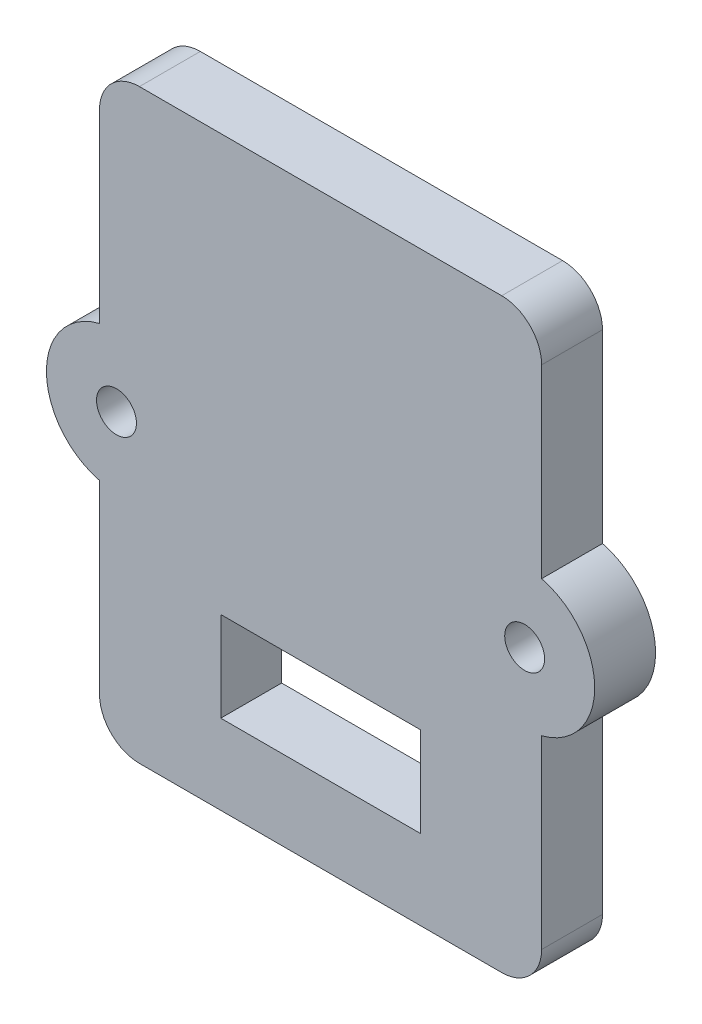
ISO-10303-21;
HEADER;
FILE_DESCRIPTION(('STEP AP214'),'2;1');
FILE_NAME('part.step','',(''),(''),'','','');
FILE_SCHEMA(('AUTOMOTIVE_DESIGN { 1 0 10303 214 1 1 1 1 }'));
ENDSEC;
DATA;
#1=APPLICATION_CONTEXT('core data for automotive mechanical design processes');
#2=APPLICATION_PROTOCOL_DEFINITION('international standard','automotive_design',2000,#1);
#3=PRODUCT_CONTEXT('',#1,'mechanical');
#4=PRODUCT('Part','Part','',(#3));
#5=PRODUCT_RELATED_PRODUCT_CATEGORY('part','',(#4));
#6=PRODUCT_DEFINITION_FORMATION('','',#4);
#7=PRODUCT_DEFINITION_CONTEXT('part definition',#1,'design');
#8=PRODUCT_DEFINITION('design','',#6,#7);
#9=PRODUCT_DEFINITION_SHAPE('','',#8);
#10=(LENGTH_UNIT() NAMED_UNIT(*) SI_UNIT(.MILLI.,.METRE.));
#11=(NAMED_UNIT(*) PLANE_ANGLE_UNIT() SI_UNIT($,.RADIAN.));
#12=(NAMED_UNIT(*) SI_UNIT($,.STERADIAN.) SOLID_ANGLE_UNIT());
#13=UNCERTAINTY_MEASURE_WITH_UNIT(LENGTH_MEASURE(1.E-05),#10,'distance_accuracy_value','');
#14=(GEOMETRIC_REPRESENTATION_CONTEXT(3) GLOBAL_UNCERTAINTY_ASSIGNED_CONTEXT((#13)) GLOBAL_UNIT_ASSIGNED_CONTEXT((#10,
#11,#12)) REPRESENTATION_CONTEXT('',''));
#15=CARTESIAN_POINT('',(0.,0.,0.));
#16=DIRECTION('',(0.,0.,1.));
#17=DIRECTION('',(1.,0.,0.));
#18=AXIS2_PLACEMENT_3D('',#15,#16,#17);
#19=CARTESIAN_POINT('',(-9.075,-0.233587825680568,3.05));
#20=DIRECTION('',(0.,0.,-1.));
#21=DIRECTION('',(-1.,0.,0.));
#22=AXIS2_PLACEMENT_3D('',#19,#20,#21);
#23=PLANE('',#22);
#24=CARTESIAN_POINT('',(10.225,12.45,3.05));
#25=DIRECTION('',(0.,0.,1.));
#26=DIRECTION('',(-1.,0.,0.));
#27=AXIS2_PLACEMENT_3D('',#24,#25,#26);
#28=CIRCLE('',#27,1.);
#29=CARTESIAN_POINT('',(9.225,12.45,3.05));
#30=VERTEX_POINT('',#29);
#31=EDGE_CURVE('E190',#30,#30,#28,.T.);
#32=ORIENTED_EDGE('',*,*,#31,.F.);
#33=EDGE_LOOP('',(#32));
#34=FACE_BOUND('',#33,.T.);
#35=CARTESIAN_POINT('',(-10.225,12.45,3.05));
#36=DIRECTION('',(0.,0.,1.));
#37=DIRECTION('',(1.,0.,0.));
#38=AXIS2_PLACEMENT_3D('',#35,#36,#37);
#39=CIRCLE('',#38,1.);
#40=CARTESIAN_POINT('',(-9.22499999999999,12.45,3.05));
#41=VERTEX_POINT('',#40);
#42=EDGE_CURVE('E196',#41,#41,#39,.T.);
#43=ORIENTED_EDGE('',*,*,#42,.F.);
#44=EDGE_LOOP('',(#43));
#45=FACE_BOUND('',#44,.T.);
#46=CARTESIAN_POINT('',(-9.075,-0.233587825680568,3.05));
#47=DIRECTION('',(0.,0.,1.));
#48=DIRECTION('',(-1.,0.,0.));
#49=AXIS2_PLACEMENT_3D('',#46,#47,#48);
#50=CIRCLE('',#49,2.);
#51=CARTESIAN_POINT('',(-11.075,-0.233587825680554,3.05));
#52=VERTEX_POINT('',#51);
#53=CARTESIAN_POINT('',(-9.07499999999998,-2.23358782568057,3.05));
#54=VERTEX_POINT('',#53);
#55=EDGE_CURVE('E202',#52,#54,#50,.T.);
#56=ORIENTED_EDGE('',*,*,#55,.T.);
#57=DIRECTION('',(1.,0.,0.));
#58=VECTOR('',#57,1.);
#59=CARTESIAN_POINT('',(-9.07499999999998,-2.23358782568057,3.05));
#60=LINE('',#59,#58);
#61=CARTESIAN_POINT('',(9.07499999999999,-2.23358782568057,3.05));
#62=VERTEX_POINT('',#61);
#63=EDGE_CURVE('E205',#54,#62,#60,.T.);
#64=ORIENTED_EDGE('',*,*,#63,.T.);
#65=CARTESIAN_POINT('',(9.075,-0.233587825680566,3.05));
#66=DIRECTION('',(0.,0.,1.));
#67=DIRECTION('',(1.,0.,0.));
#68=AXIS2_PLACEMENT_3D('',#65,#66,#67);
#69=CIRCLE('',#68,2.);
#70=CARTESIAN_POINT('',(11.075,-0.233587825680566,3.05));
#71=VERTEX_POINT('',#70);
#72=EDGE_CURVE('E208',#62,#71,#69,.T.);
#73=ORIENTED_EDGE('',*,*,#72,.T.);
#74=DIRECTION('',(0.,1.,0.));
#75=VECTOR('',#74,1.);
#76=CARTESIAN_POINT('',(11.075,-0.233587825680551,3.05));
#77=LINE('',#76,#75);
#78=CARTESIAN_POINT('',(11.075,9.04447507717238,3.05));
#79=VERTEX_POINT('',#78);
#80=EDGE_CURVE('E210',#71,#79,#77,.T.);
#81=ORIENTED_EDGE('',*,*,#80,.T.);
#82=CARTESIAN_POINT('',(10.225,12.45,3.05));
#83=DIRECTION('',(0.,0.,1.));
#84=DIRECTION('',(-1.,0.,0.));
#85=AXIS2_PLACEMENT_3D('',#82,#83,#84);
#86=CIRCLE('',#85,3.51);
#87=CARTESIAN_POINT('',(11.075,15.8555249228276,3.05));
#88=VERTEX_POINT('',#87);
#89=EDGE_CURVE('E212',#79,#88,#86,.T.);
#90=ORIENTED_EDGE('',*,*,#89,.T.);
#91=DIRECTION('',(0.,1.,0.));
#92=VECTOR('',#91,1.);
#93=CARTESIAN_POINT('',(11.075,15.8555249228276,3.05));
#94=LINE('',#93,#92);
#95=CARTESIAN_POINT('',(11.075,25.1335878256805,3.05));
#96=VERTEX_POINT('',#95);
#97=EDGE_CURVE('E214',#88,#96,#94,.T.);
#98=ORIENTED_EDGE('',*,*,#97,.T.);
#99=CARTESIAN_POINT('',(9.075,25.1335878256806,3.05));
#100=DIRECTION('',(0.,0.,1.));
#101=DIRECTION('',(-1.,0.,0.));
#102=AXIS2_PLACEMENT_3D('',#99,#100,#101);
#103=CIRCLE('',#102,2.);
#104=CARTESIAN_POINT('',(9.07499999999999,27.1335878256806,3.05));
#105=VERTEX_POINT('',#104);
#106=EDGE_CURVE('E216',#96,#105,#103,.T.);
#107=ORIENTED_EDGE('',*,*,#106,.T.);
#108=DIRECTION('',(-1.,0.,0.));
#109=VECTOR('',#108,1.);
#110=CARTESIAN_POINT('',(-9.07499999999999,27.1335878256806,3.05));
#111=LINE('',#110,#109);
#112=CARTESIAN_POINT('',(-9.07499999999999,27.1335878256806,3.05));
#113=VERTEX_POINT('',#112);
#114=EDGE_CURVE('E218',#105,#113,#111,.T.);
#115=ORIENTED_EDGE('',*,*,#114,.T.);
#116=CARTESIAN_POINT('',(-9.075,25.1335878256806,3.05));
#117=DIRECTION('',(0.,0.,1.));
#118=DIRECTION('',(-1.,0.,0.));
#119=AXIS2_PLACEMENT_3D('',#116,#117,#118);
#120=CIRCLE('',#119,2.);
#121=CARTESIAN_POINT('',(-11.075,25.1335878256805,3.05));
#122=VERTEX_POINT('',#121);
#123=EDGE_CURVE('E220',#113,#122,#120,.T.);
#124=ORIENTED_EDGE('',*,*,#123,.T.);
#125=DIRECTION('',(0.,-1.,0.));
#126=VECTOR('',#125,1.);
#127=CARTESIAN_POINT('',(-11.075,15.8555249228276,3.05));
#128=LINE('',#127,#126);
#129=CARTESIAN_POINT('',(-11.075,15.8555249228276,3.05));
#130=VERTEX_POINT('',#129);
#131=EDGE_CURVE('E222',#122,#130,#128,.T.);
#132=ORIENTED_EDGE('',*,*,#131,.T.);
#133=CARTESIAN_POINT('',(-10.225,12.45,3.05));
#134=DIRECTION('',(0.,0.,1.));
#135=DIRECTION('',(1.,0.,0.));
#136=AXIS2_PLACEMENT_3D('',#133,#134,#135);
#137=CIRCLE('',#136,3.51);
#138=CARTESIAN_POINT('',(-11.075,9.04447507717239,3.05));
#139=VERTEX_POINT('',#138);
#140=EDGE_CURVE('E224',#130,#139,#137,.T.);
#141=ORIENTED_EDGE('',*,*,#140,.T.);
#142=DIRECTION('',(0.,-1.,0.));
#143=VECTOR('',#142,1.);
#144=CARTESIAN_POINT('',(-11.075,-0.233587825680554,3.05));
#145=LINE('',#144,#143);
#146=EDGE_CURVE('E226',#139,#52,#145,.T.);
#147=ORIENTED_EDGE('',*,*,#146,.T.);
#148=EDGE_LOOP('',(#56,#64,#73,#81,#90,#98,#107,#115,#124,#132,#141,#147));
#149=FACE_BOUND('',#148,.T.);
#150=DIRECTION('',(0.,1.,0.));
#151=VECTOR('',#150,1.);
#152=CARTESIAN_POINT('',(5.,1.76641217431943,3.05));
#153=LINE('',#152,#151);
#154=CARTESIAN_POINT('',(5.,1.76641217431943,3.05));
#155=VERTEX_POINT('',#154);
#156=CARTESIAN_POINT('',(5.,6.26641217431943,3.05));
#157=VERTEX_POINT('',#156);
#158=EDGE_CURVE('E154',#155,#157,#153,.T.);
#159=ORIENTED_EDGE('',*,*,#158,.F.);
#160=DIRECTION('',(1.,0.,0.));
#161=VECTOR('',#160,1.);
#162=CARTESIAN_POINT('',(-5.,1.76641217431943,3.05));
#163=LINE('',#162,#161);
#164=CARTESIAN_POINT('',(-5.,1.76641217431943,3.05));
#165=VERTEX_POINT('',#164);
#166=EDGE_CURVE('E176',#165,#155,#163,.T.);
#167=ORIENTED_EDGE('',*,*,#166,.F.);
#168=DIRECTION('',(0.,-1.,0.));
#169=VECTOR('',#168,1.);
#170=CARTESIAN_POINT('',(-5.,1.76641217431943,3.05));
#171=LINE('',#170,#169);
#172=CARTESIAN_POINT('',(-5.,6.26641217431943,3.05));
#173=VERTEX_POINT('',#172);
#174=EDGE_CURVE('E174',#173,#165,#171,.T.);
#175=ORIENTED_EDGE('',*,*,#174,.F.);
#176=DIRECTION('',(-1.,0.,0.));
#177=VECTOR('',#176,1.);
#178=CARTESIAN_POINT('',(-5.,6.26641217431943,3.05));
#179=LINE('',#178,#177);
#180=EDGE_CURVE('E162',#157,#173,#179,.T.);
#181=ORIENTED_EDGE('',*,*,#180,.F.);
#182=EDGE_LOOP('',(#159,#167,#175,#181));
#183=FACE_BOUND('',#182,.T.);
#184=ADVANCED_FACE('F41',(#34,#45,#149,#183),#23,.F.);
#185=CARTESIAN_POINT('',(-9.075,-0.233587825680568,0.));
#186=DIRECTION('',(0.,0.,-1.));
#187=DIRECTION('',(-1.,0.,0.));
#188=AXIS2_PLACEMENT_3D('',#185,#186,#187);
#189=PLANE('',#188);
#190=CARTESIAN_POINT('',(-10.225,12.45,0.));
#191=DIRECTION('',(0.,0.,1.));
#192=DIRECTION('',(1.,0.,0.));
#193=AXIS2_PLACEMENT_3D('',#190,#191,#192);
#194=CIRCLE('',#193,1.);
#195=CARTESIAN_POINT('',(-9.22499999999999,12.45,0.));
#196=VERTEX_POINT('',#195);
#197=EDGE_CURVE('E193',#196,#196,#194,.T.);
#198=ORIENTED_EDGE('',*,*,#197,.T.);
#199=EDGE_LOOP('',(#198));
#200=FACE_BOUND('',#199,.T.);
#201=CARTESIAN_POINT('',(-9.075,-0.233587825680568,0.));
#202=DIRECTION('',(0.,0.,1.));
#203=DIRECTION('',(-1.,0.,0.));
#204=AXIS2_PLACEMENT_3D('',#201,#202,#203);
#205=CIRCLE('',#204,2.);
#206=CARTESIAN_POINT('',(-11.075,-0.233587825680554,0.));
#207=VERTEX_POINT('',#206);
#208=CARTESIAN_POINT('',(-9.07499999999998,-2.23358782568057,0.));
#209=VERTEX_POINT('',#208);
#210=EDGE_CURVE('E199',#207,#209,#205,.T.);
#211=ORIENTED_EDGE('',*,*,#210,.F.);
#212=DIRECTION('',(0.,-1.,0.));
#213=VECTOR('',#212,1.);
#214=CARTESIAN_POINT('',(-11.075,-0.233587825680554,0.));
#215=LINE('',#214,#213);
#216=CARTESIAN_POINT('',(-11.075,9.04447507717239,0.));
#217=VERTEX_POINT('',#216);
#218=EDGE_CURVE('E206',#217,#207,#215,.T.);
#219=ORIENTED_EDGE('',*,*,#218,.F.);
#220=CARTESIAN_POINT('',(-10.225,12.45,0.));
#221=DIRECTION('',(0.,0.,1.));
#222=DIRECTION('',(1.,0.,0.));
#223=AXIS2_PLACEMENT_3D('',#220,#221,#222);
#224=CIRCLE('',#223,3.51);
#225=CARTESIAN_POINT('',(-11.075,15.8555249228276,0.));
#226=VERTEX_POINT('',#225);
#227=EDGE_CURVE('E249',#226,#217,#224,.T.);
#228=ORIENTED_EDGE('',*,*,#227,.F.);
#229=DIRECTION('',(0.,-1.,0.));
#230=VECTOR('',#229,1.);
#231=CARTESIAN_POINT('',(-11.075,15.8555249228276,0.));
#232=LINE('',#231,#230);
#233=CARTESIAN_POINT('',(-11.075,25.1335878256805,0.));
#234=VERTEX_POINT('',#233);
#235=EDGE_CURVE('E247',#234,#226,#232,.T.);
#236=ORIENTED_EDGE('',*,*,#235,.F.);
#237=CARTESIAN_POINT('',(-9.075,25.1335878256806,0.));
#238=DIRECTION('',(0.,0.,1.));
#239=DIRECTION('',(-1.,0.,0.));
#240=AXIS2_PLACEMENT_3D('',#237,#238,#239);
#241=CIRCLE('',#240,2.);
#242=CARTESIAN_POINT('',(-9.07499999999999,27.1335878256806,0.));
#243=VERTEX_POINT('',#242);
#244=EDGE_CURVE('E245',#243,#234,#241,.T.);
#245=ORIENTED_EDGE('',*,*,#244,.F.);
#246=DIRECTION('',(-1.,0.,0.));
#247=VECTOR('',#246,1.);
#248=CARTESIAN_POINT('',(-9.07499999999999,27.1335878256806,0.));
#249=LINE('',#248,#247);
#250=CARTESIAN_POINT('',(9.07499999999999,27.1335878256806,0.));
#251=VERTEX_POINT('',#250);
#252=EDGE_CURVE('E243',#251,#243,#249,.T.);
#253=ORIENTED_EDGE('',*,*,#252,.F.);
#254=CARTESIAN_POINT('',(9.075,25.1335878256806,0.));
#255=DIRECTION('',(0.,0.,1.));
#256=DIRECTION('',(-1.,0.,0.));
#257=AXIS2_PLACEMENT_3D('',#254,#255,#256);
#258=CIRCLE('',#257,2.);
#259=CARTESIAN_POINT('',(11.075,25.1335878256805,0.));
#260=VERTEX_POINT('',#259);
#261=EDGE_CURVE('E241',#260,#251,#258,.T.);
#262=ORIENTED_EDGE('',*,*,#261,.F.);
#263=DIRECTION('',(0.,1.,0.));
#264=VECTOR('',#263,1.);
#265=CARTESIAN_POINT('',(11.075,15.8555249228276,0.));
#266=LINE('',#265,#264);
#267=CARTESIAN_POINT('',(11.075,15.8555249228276,0.));
#268=VERTEX_POINT('',#267);
#269=EDGE_CURVE('E239',#268,#260,#266,.T.);
#270=ORIENTED_EDGE('',*,*,#269,.F.);
#271=CARTESIAN_POINT('',(10.225,12.45,0.));
#272=DIRECTION('',(0.,0.,1.));
#273=DIRECTION('',(-1.,0.,0.));
#274=AXIS2_PLACEMENT_3D('',#271,#272,#273);
#275=CIRCLE('',#274,3.51);
#276=CARTESIAN_POINT('',(11.075,9.04447507717238,0.));
#277=VERTEX_POINT('',#276);
#278=EDGE_CURVE('E237',#277,#268,#275,.T.);
#279=ORIENTED_EDGE('',*,*,#278,.F.);
#280=DIRECTION('',(0.,1.,0.));
#281=VECTOR('',#280,1.);
#282=CARTESIAN_POINT('',(11.075,-0.233587825680551,0.));
#283=LINE('',#282,#281);
#284=CARTESIAN_POINT('',(11.075,-0.233587825680566,0.));
#285=VERTEX_POINT('',#284);
#286=EDGE_CURVE('E235',#285,#277,#283,.T.);
#287=ORIENTED_EDGE('',*,*,#286,.F.);
#288=CARTESIAN_POINT('',(9.075,-0.233587825680566,0.));
#289=DIRECTION('',(0.,0.,1.));
#290=DIRECTION('',(1.,0.,0.));
#291=AXIS2_PLACEMENT_3D('',#288,#289,#290);
#292=CIRCLE('',#291,2.);
#293=CARTESIAN_POINT('',(9.07499999999999,-2.23358782568057,0.));
#294=VERTEX_POINT('',#293);
#295=EDGE_CURVE('E233',#294,#285,#292,.T.);
#296=ORIENTED_EDGE('',*,*,#295,.F.);
#297=DIRECTION('',(1.,0.,0.));
#298=VECTOR('',#297,1.);
#299=CARTESIAN_POINT('',(-9.07499999999998,-2.23358782568057,0.));
#300=LINE('',#299,#298);
#301=EDGE_CURVE('E231',#209,#294,#300,.T.);
#302=ORIENTED_EDGE('',*,*,#301,.F.);
#303=EDGE_LOOP('',(#211,#219,#228,#236,#245,#253,#262,#270,#279,#287,#296,#302));
#304=FACE_BOUND('',#303,.T.);
#305=CARTESIAN_POINT('',(10.225,12.45,0.));
#306=DIRECTION('',(0.,0.,1.));
#307=DIRECTION('',(-1.,0.,0.));
#308=AXIS2_PLACEMENT_3D('',#305,#306,#307);
#309=CIRCLE('',#308,1.);
#310=CARTESIAN_POINT('',(9.225,12.45,0.));
#311=VERTEX_POINT('',#310);
#312=EDGE_CURVE('E170',#311,#311,#309,.T.);
#313=ORIENTED_EDGE('',*,*,#312,.T.);
#314=EDGE_LOOP('',(#313));
#315=FACE_BOUND('',#314,.T.);
#316=DIRECTION('',(1.,0.,0.));
#317=VECTOR('',#316,1.);
#318=CARTESIAN_POINT('',(-5.,1.76641217431943,0.));
#319=LINE('',#318,#317);
#320=CARTESIAN_POINT('',(-5.,1.76641217431943,0.));
#321=VERTEX_POINT('',#320);
#322=CARTESIAN_POINT('',(5.,1.76641217431943,0.));
#323=VERTEX_POINT('',#322);
#324=EDGE_CURVE('E163',#321,#323,#319,.T.);
#325=ORIENTED_EDGE('',*,*,#324,.T.);
#326=DIRECTION('',(0.,1.,0.));
#327=VECTOR('',#326,1.);
#328=CARTESIAN_POINT('',(5.,1.76641217431943,0.));
#329=LINE('',#328,#327);
#330=CARTESIAN_POINT('',(5.,6.26641217431943,0.));
#331=VERTEX_POINT('',#330);
#332=EDGE_CURVE('E64',#323,#331,#329,.T.);
#333=ORIENTED_EDGE('',*,*,#332,.T.);
#334=DIRECTION('',(-1.,0.,0.));
#335=VECTOR('',#334,1.);
#336=CARTESIAN_POINT('',(-5.,6.26641217431943,0.));
#337=LINE('',#336,#335);
#338=CARTESIAN_POINT('',(-5.,6.26641217431943,0.));
#339=VERTEX_POINT('',#338);
#340=EDGE_CURVE('E169',#331,#339,#337,.T.);
#341=ORIENTED_EDGE('',*,*,#340,.T.);
#342=DIRECTION('',(0.,-1.,0.));
#343=VECTOR('',#342,1.);
#344=CARTESIAN_POINT('',(-5.,1.76641217431943,0.));
#345=LINE('',#344,#343);
#346=EDGE_CURVE('E182',#339,#321,#345,.T.);
#347=ORIENTED_EDGE('',*,*,#346,.T.);
#348=EDGE_LOOP('',(#325,#333,#341,#347));
#349=FACE_BOUND('',#348,.T.);
#350=ADVANCED_FACE('F291',(#200,#304,#315,#349),#189,.T.);
#351=CARTESIAN_POINT('',(-9.075,-0.233587825680568,3.05));
#352=DIRECTION('',(0.,0.,-1.));
#353=DIRECTION('',(-1.,0.,0.));
#354=AXIS2_PLACEMENT_3D('',#351,#352,#353);
#355=CYLINDRICAL_SURFACE('',#354,2.);
#356=ORIENTED_EDGE('',*,*,#210,.T.);
#357=DIRECTION('',(0.,0.,-1.));
#358=VECTOR('',#357,1.);
#359=CARTESIAN_POINT('',(-9.07499999999998,-2.23358782568057,3.05));
#360=LINE('',#359,#358);
#361=EDGE_CURVE('E11',#54,#209,#360,.T.);
#362=ORIENTED_EDGE('',*,*,#361,.F.);
#363=ORIENTED_EDGE('',*,*,#55,.F.);
#364=DIRECTION('',(0.,0.,-1.));
#365=VECTOR('',#364,1.);
#366=CARTESIAN_POINT('',(-11.075,-0.233587825680554,3.05));
#367=LINE('',#366,#365);
#368=EDGE_CURVE('E228',#52,#207,#367,.T.);
#369=ORIENTED_EDGE('',*,*,#368,.T.);
#370=EDGE_LOOP('',(#356,#362,#363,#369));
#371=FACE_BOUND('',#370,.T.);
#372=ADVANCED_FACE('F43',(#371),#355,.T.);
#373=CARTESIAN_POINT('',(-9.07499999999998,-2.23358782568057,3.05));
#374=DIRECTION('',(0.,1.,0.));
#375=DIRECTION('',(-1.,0.,0.));
#376=AXIS2_PLACEMENT_3D('',#373,#374,#375);
#377=PLANE('',#376);
#378=ORIENTED_EDGE('',*,*,#301,.T.);
#379=DIRECTION('',(0.,0.,-1.));
#380=VECTOR('',#379,1.);
#381=CARTESIAN_POINT('',(9.07499999999999,-2.23358782568057,3.05));
#382=LINE('',#381,#380);
#383=EDGE_CURVE('E49',#62,#294,#382,.T.);
#384=ORIENTED_EDGE('',*,*,#383,.F.);
#385=ORIENTED_EDGE('',*,*,#63,.F.);
#386=ORIENTED_EDGE('',*,*,#361,.T.);
#387=EDGE_LOOP('',(#378,#384,#385,#386));
#388=FACE_BOUND('',#387,.T.);
#389=ADVANCED_FACE('F308',(#388),#377,.F.);
#390=CARTESIAN_POINT('',(9.075,-0.233587825680566,3.05));
#391=DIRECTION('',(0.,0.,-1.));
#392=DIRECTION('',(-1.,0.,0.));
#393=AXIS2_PLACEMENT_3D('',#390,#391,#392);
#394=CYLINDRICAL_SURFACE('',#393,2.);
#395=ORIENTED_EDGE('',*,*,#295,.T.);
#396=DIRECTION('',(0.,0.,-1.));
#397=VECTOR('',#396,1.);
#398=CARTESIAN_POINT('',(11.075,-0.233587825680566,3.05));
#399=LINE('',#398,#397);
#400=EDGE_CURVE('E278',#71,#285,#399,.T.);
#401=ORIENTED_EDGE('',*,*,#400,.F.);
#402=ORIENTED_EDGE('',*,*,#72,.F.);
#403=ORIENTED_EDGE('',*,*,#383,.T.);
#404=EDGE_LOOP('',(#395,#401,#402,#403));
#405=FACE_BOUND('',#404,.T.);
#406=ADVANCED_FACE('F285',(#405),#394,.T.);
#407=CARTESIAN_POINT('',(11.075,-0.233587825680551,3.05));
#408=DIRECTION('',(-1.,0.,0.));
#409=DIRECTION('',(0.,0.,1.));
#410=AXIS2_PLACEMENT_3D('',#407,#408,#409);
#411=PLANE('',#410);
#412=ORIENTED_EDGE('',*,*,#286,.T.);
#413=DIRECTION('',(0.,0.,-1.));
#414=VECTOR('',#413,1.);
#415=CARTESIAN_POINT('',(11.075,9.04447507717238,3.05));
#416=LINE('',#415,#414);
#417=EDGE_CURVE('E275',#79,#277,#416,.T.);
#418=ORIENTED_EDGE('',*,*,#417,.F.);
#419=ORIENTED_EDGE('',*,*,#80,.F.);
#420=ORIENTED_EDGE('',*,*,#400,.T.);
#421=EDGE_LOOP('',(#412,#418,#419,#420));
#422=FACE_BOUND('',#421,.T.);
#423=ADVANCED_FACE('F297',(#422),#411,.F.);
#424=CARTESIAN_POINT('',(10.225,12.45,3.05));
#425=DIRECTION('',(0.,0.,-1.));
#426=DIRECTION('',(-1.,0.,0.));
#427=AXIS2_PLACEMENT_3D('',#424,#425,#426);
#428=CYLINDRICAL_SURFACE('',#427,3.51);
#429=ORIENTED_EDGE('',*,*,#278,.T.);
#430=DIRECTION('',(0.,0.,-1.));
#431=VECTOR('',#430,1.);
#432=CARTESIAN_POINT('',(11.075,15.8555249228276,3.05));
#433=LINE('',#432,#431);
#434=EDGE_CURVE('E272',#88,#268,#433,.T.);
#435=ORIENTED_EDGE('',*,*,#434,.F.);
#436=ORIENTED_EDGE('',*,*,#89,.F.);
#437=ORIENTED_EDGE('',*,*,#417,.T.);
#438=EDGE_LOOP('',(#429,#435,#436,#437));
#439=FACE_BOUND('',#438,.T.);
#440=ADVANCED_FACE('F301',(#439),#428,.T.);
#441=CARTESIAN_POINT('',(11.075,15.8555249228276,3.05));
#442=DIRECTION('',(-1.,0.,0.));
#443=DIRECTION('',(0.,0.,1.));
#444=AXIS2_PLACEMENT_3D('',#441,#442,#443);
#445=PLANE('',#444);
#446=ORIENTED_EDGE('',*,*,#269,.T.);
#447=DIRECTION('',(0.,0.,-1.));
#448=VECTOR('',#447,1.);
#449=CARTESIAN_POINT('',(11.075,25.1335878256805,3.05));
#450=LINE('',#449,#448);
#451=EDGE_CURVE('E269',#96,#260,#450,.T.);
#452=ORIENTED_EDGE('',*,*,#451,.F.);
#453=ORIENTED_EDGE('',*,*,#97,.F.);
#454=ORIENTED_EDGE('',*,*,#434,.T.);
#455=EDGE_LOOP('',(#446,#452,#453,#454));
#456=FACE_BOUND('',#455,.T.);
#457=ADVANCED_FACE('F341',(#456),#445,.F.);
#458=CARTESIAN_POINT('',(9.075,25.1335878256806,3.05));
#459=DIRECTION('',(0.,0.,-1.));
#460=DIRECTION('',(-1.,0.,0.));
#461=AXIS2_PLACEMENT_3D('',#458,#459,#460);
#462=CYLINDRICAL_SURFACE('',#461,2.);
#463=ORIENTED_EDGE('',*,*,#261,.T.);
#464=DIRECTION('',(0.,0.,-1.));
#465=VECTOR('',#464,1.);
#466=CARTESIAN_POINT('',(9.07499999999999,27.1335878256806,3.05));
#467=LINE('',#466,#465);
#468=EDGE_CURVE('E266',#105,#251,#467,.T.);
#469=ORIENTED_EDGE('',*,*,#468,.F.);
#470=ORIENTED_EDGE('',*,*,#106,.F.);
#471=ORIENTED_EDGE('',*,*,#451,.T.);
#472=EDGE_LOOP('',(#463,#469,#470,#471));
#473=FACE_BOUND('',#472,.T.);
#474=ADVANCED_FACE('F339',(#473),#462,.T.);
#475=CARTESIAN_POINT('',(-9.07499999999999,27.1335878256806,3.05));
#476=DIRECTION('',(0.,-1.,0.));
#477=DIRECTION('',(1.,0.,0.));
#478=AXIS2_PLACEMENT_3D('',#475,#476,#477);
#479=PLANE('',#478);
#480=ORIENTED_EDGE('',*,*,#252,.T.);
#481=DIRECTION('',(0.,0.,-1.));
#482=VECTOR('',#481,1.);
#483=CARTESIAN_POINT('',(-9.07499999999999,27.1335878256806,3.05));
#484=LINE('',#483,#482);
#485=EDGE_CURVE('E263',#113,#243,#484,.T.);
#486=ORIENTED_EDGE('',*,*,#485,.F.);
#487=ORIENTED_EDGE('',*,*,#114,.F.);
#488=ORIENTED_EDGE('',*,*,#468,.T.);
#489=EDGE_LOOP('',(#480,#486,#487,#488));
#490=FACE_BOUND('',#489,.T.);
#491=ADVANCED_FACE('F335',(#490),#479,.F.);
#492=CARTESIAN_POINT('',(-9.075,25.1335878256806,3.05));
#493=DIRECTION('',(0.,0.,-1.));
#494=DIRECTION('',(-1.,0.,0.));
#495=AXIS2_PLACEMENT_3D('',#492,#493,#494);
#496=CYLINDRICAL_SURFACE('',#495,2.);
#497=ORIENTED_EDGE('',*,*,#244,.T.);
#498=DIRECTION('',(0.,0.,-1.));
#499=VECTOR('',#498,1.);
#500=CARTESIAN_POINT('',(-11.075,25.1335878256805,3.05));
#501=LINE('',#500,#499);
#502=EDGE_CURVE('E260',#122,#234,#501,.T.);
#503=ORIENTED_EDGE('',*,*,#502,.F.);
#504=ORIENTED_EDGE('',*,*,#123,.F.);
#505=ORIENTED_EDGE('',*,*,#485,.T.);
#506=EDGE_LOOP('',(#497,#503,#504,#505));
#507=FACE_BOUND('',#506,.T.);
#508=ADVANCED_FACE('F330',(#507),#496,.T.);
#509=CARTESIAN_POINT('',(-11.075,15.8555249228276,3.05));
#510=DIRECTION('',(1.,0.,0.));
#511=DIRECTION('',(0.,1.,0.));
#512=AXIS2_PLACEMENT_3D('',#509,#510,#511);
#513=PLANE('',#512);
#514=ORIENTED_EDGE('',*,*,#235,.T.);
#515=DIRECTION('',(0.,0.,-1.));
#516=VECTOR('',#515,1.);
#517=CARTESIAN_POINT('',(-11.075,15.8555249228276,3.05));
#518=LINE('',#517,#516);
#519=EDGE_CURVE('E257',#130,#226,#518,.T.);
#520=ORIENTED_EDGE('',*,*,#519,.F.);
#521=ORIENTED_EDGE('',*,*,#131,.F.);
#522=ORIENTED_EDGE('',*,*,#502,.T.);
#523=EDGE_LOOP('',(#514,#520,#521,#522));
#524=FACE_BOUND('',#523,.T.);
#525=ADVANCED_FACE('F324',(#524),#513,.F.);
#526=CARTESIAN_POINT('',(-10.225,12.45,3.05));
#527=DIRECTION('',(0.,0.,-1.));
#528=DIRECTION('',(-1.,0.,0.));
#529=AXIS2_PLACEMENT_3D('',#526,#527,#528);
#530=CYLINDRICAL_SURFACE('',#529,3.51);
#531=ORIENTED_EDGE('',*,*,#227,.T.);
#532=DIRECTION('',(0.,0.,-1.));
#533=VECTOR('',#532,1.);
#534=CARTESIAN_POINT('',(-11.075,9.04447507717239,3.05));
#535=LINE('',#534,#533);
#536=EDGE_CURVE('E254',#139,#217,#535,.T.);
#537=ORIENTED_EDGE('',*,*,#536,.F.);
#538=ORIENTED_EDGE('',*,*,#140,.F.);
#539=ORIENTED_EDGE('',*,*,#519,.T.);
#540=EDGE_LOOP('',(#531,#537,#538,#539));
#541=FACE_BOUND('',#540,.T.);
#542=ADVANCED_FACE('F320',(#541),#530,.T.);
#543=CARTESIAN_POINT('',(-11.075,-0.233587825680554,3.05));
#544=DIRECTION('',(1.,0.,0.));
#545=DIRECTION('',(0.,1.,0.));
#546=AXIS2_PLACEMENT_3D('',#543,#544,#545);
#547=PLANE('',#546);
#548=ORIENTED_EDGE('',*,*,#218,.T.);
#549=ORIENTED_EDGE('',*,*,#368,.F.);
#550=ORIENTED_EDGE('',*,*,#146,.F.);
#551=ORIENTED_EDGE('',*,*,#536,.T.);
#552=EDGE_LOOP('',(#548,#549,#550,#551));
#553=FACE_BOUND('',#552,.T.);
#554=ADVANCED_FACE('F315',(#553),#547,.F.);
#555=CARTESIAN_POINT('',(-10.225,12.45,3.05));
#556=DIRECTION('',(0.,0.,-1.));
#557=DIRECTION('',(-1.,0.,0.));
#558=AXIS2_PLACEMENT_3D('',#555,#556,#557);
#559=CYLINDRICAL_SURFACE('',#558,1.);
#560=ORIENTED_EDGE('',*,*,#42,.T.);
#561=EDGE_LOOP('',(#560));
#562=FACE_BOUND('',#561,.T.);
#563=ORIENTED_EDGE('',*,*,#197,.F.);
#564=EDGE_LOOP('',(#563));
#565=FACE_BOUND('',#564,.T.);
#566=ADVANCED_FACE('F361',(#562,#565),#559,.F.);
#567=CARTESIAN_POINT('',(10.225,12.45,3.05));
#568=DIRECTION('',(0.,0.,-1.));
#569=DIRECTION('',(-1.,0.,0.));
#570=AXIS2_PLACEMENT_3D('',#567,#568,#569);
#571=CYLINDRICAL_SURFACE('',#570,1.);
#572=ORIENTED_EDGE('',*,*,#31,.T.);
#573=EDGE_LOOP('',(#572));
#574=FACE_BOUND('',#573,.T.);
#575=ORIENTED_EDGE('',*,*,#312,.F.);
#576=EDGE_LOOP('',(#575));
#577=FACE_BOUND('',#576,.T.);
#578=ADVANCED_FACE('F404',(#574,#577),#571,.F.);
#579=CARTESIAN_POINT('',(5.,1.76641217431943,3.05));
#580=DIRECTION('',(-1.,0.,0.));
#581=DIRECTION('',(0.,0.,1.));
#582=AXIS2_PLACEMENT_3D('',#579,#580,#581);
#583=PLANE('',#582);
#584=ORIENTED_EDGE('',*,*,#332,.F.);
#585=DIRECTION('',(0.,0.,-1.));
#586=VECTOR('',#585,1.);
#587=CARTESIAN_POINT('',(5.,1.76641217431943,3.05));
#588=LINE('',#587,#586);
#589=EDGE_CURVE('E158',#155,#323,#588,.T.);
#590=ORIENTED_EDGE('',*,*,#589,.F.);
#591=ORIENTED_EDGE('',*,*,#158,.T.);
#592=DIRECTION('',(0.,0.,-1.));
#593=VECTOR('',#592,1.);
#594=CARTESIAN_POINT('',(5.,6.26641217431943,3.05));
#595=LINE('',#594,#593);
#596=EDGE_CURVE('E157',#157,#331,#595,.T.);
#597=ORIENTED_EDGE('',*,*,#596,.T.);
#598=EDGE_LOOP('',(#584,#590,#591,#597));
#599=FACE_BOUND('',#598,.T.);
#600=ADVANCED_FACE('F156',(#599),#583,.T.);
#601=CARTESIAN_POINT('',(-5.,6.26641217431943,3.05));
#602=DIRECTION('',(0.,-1.,0.));
#603=DIRECTION('',(1.,0.,0.));
#604=AXIS2_PLACEMENT_3D('',#601,#602,#603);
#605=PLANE('',#604);
#606=ORIENTED_EDGE('',*,*,#340,.F.);
#607=ORIENTED_EDGE('',*,*,#596,.F.);
#608=ORIENTED_EDGE('',*,*,#180,.T.);
#609=DIRECTION('',(0.,0.,-1.));
#610=VECTOR('',#609,1.);
#611=CARTESIAN_POINT('',(-5.,6.26641217431943,3.05));
#612=LINE('',#611,#610);
#613=EDGE_CURVE('E171',#173,#339,#612,.T.);
#614=ORIENTED_EDGE('',*,*,#613,.T.);
#615=EDGE_LOOP('',(#606,#607,#608,#614));
#616=FACE_BOUND('',#615,.T.);
#617=ADVANCED_FACE('F166',(#616),#605,.T.);
#618=CARTESIAN_POINT('',(-5.,1.76641217431943,3.05));
#619=DIRECTION('',(1.,0.,0.));
#620=DIRECTION('',(0.,0.,-1.));
#621=AXIS2_PLACEMENT_3D('',#618,#619,#620);
#622=PLANE('',#621);
#623=ORIENTED_EDGE('',*,*,#346,.F.);
#624=ORIENTED_EDGE('',*,*,#613,.F.);
#625=ORIENTED_EDGE('',*,*,#174,.T.);
#626=DIRECTION('',(0.,0.,-1.));
#627=VECTOR('',#626,1.);
#628=CARTESIAN_POINT('',(-5.,1.76641217431943,3.05));
#629=LINE('',#628,#627);
#630=EDGE_CURVE('E56',#165,#321,#629,.T.);
#631=ORIENTED_EDGE('',*,*,#630,.T.);
#632=EDGE_LOOP('',(#623,#624,#625,#631));
#633=FACE_BOUND('',#632,.T.);
#634=ADVANCED_FACE('F426',(#633),#622,.T.);
#635=CARTESIAN_POINT('',(-5.,1.76641217431943,3.05));
#636=DIRECTION('',(0.,1.,0.));
#637=DIRECTION('',(-1.,0.,0.));
#638=AXIS2_PLACEMENT_3D('',#635,#636,#637);
#639=PLANE('',#638);
#640=ORIENTED_EDGE('',*,*,#324,.F.);
#641=ORIENTED_EDGE('',*,*,#630,.F.);
#642=ORIENTED_EDGE('',*,*,#166,.T.);
#643=ORIENTED_EDGE('',*,*,#589,.T.);
#644=EDGE_LOOP('',(#640,#641,#642,#643));
#645=FACE_BOUND('',#644,.T.);
#646=ADVANCED_FACE('F434',(#645),#639,.T.);
#647=CLOSED_SHELL('',(#184,#350,#372,#389,#406,#423,#440,#457,#474,#491,#508,#525,#542,#554,
#566,#578,#600,#617,#634,#646));
#648=MANIFOLD_SOLID_BREP('B2',#647);
#649=ADVANCED_BREP_SHAPE_REPRESENTATION('',(#18,#648),#14);
#650=SHAPE_DEFINITION_REPRESENTATION(#9,#649);
ENDSEC;
END-ISO-10303-21;
